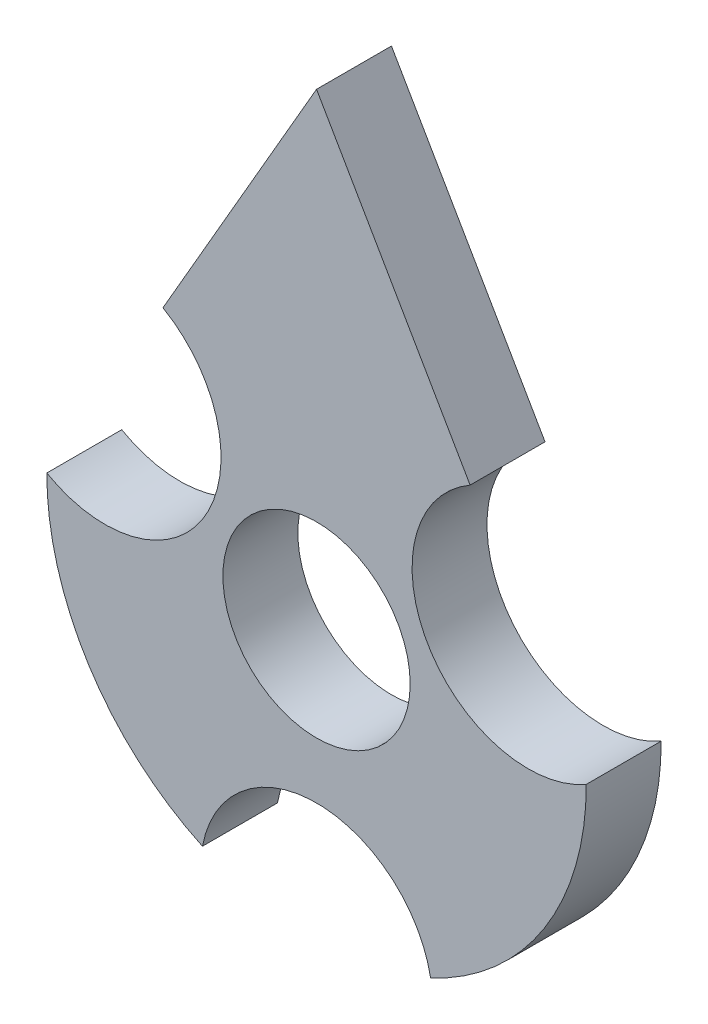
ISO-10303-21;
HEADER;
FILE_DESCRIPTION(('STEP AP214'),'2;1');
FILE_NAME('part.step','',(''),(''),'','','');
FILE_SCHEMA(('AUTOMOTIVE_DESIGN { 1 0 10303 214 1 1 1 1 }'));
ENDSEC;
DATA;
#1=APPLICATION_CONTEXT('core data for automotive mechanical design processes');
#2=APPLICATION_PROTOCOL_DEFINITION('international standard','automotive_design',2000,#1);
#3=PRODUCT_CONTEXT('',#1,'mechanical');
#4=PRODUCT('Part','Part','',(#3));
#5=PRODUCT_RELATED_PRODUCT_CATEGORY('part','',(#4));
#6=PRODUCT_DEFINITION_FORMATION('','',#4);
#7=PRODUCT_DEFINITION_CONTEXT('part definition',#1,'design');
#8=PRODUCT_DEFINITION('design','',#6,#7);
#9=PRODUCT_DEFINITION_SHAPE('','',#8);
#10=(LENGTH_UNIT() NAMED_UNIT(*) SI_UNIT(.MILLI.,.METRE.));
#11=(NAMED_UNIT(*) PLANE_ANGLE_UNIT() SI_UNIT($,.RADIAN.));
#12=(NAMED_UNIT(*) SI_UNIT($,.STERADIAN.) SOLID_ANGLE_UNIT());
#13=UNCERTAINTY_MEASURE_WITH_UNIT(LENGTH_MEASURE(1.E-05),#10,'distance_accuracy_value','');
#14=(GEOMETRIC_REPRESENTATION_CONTEXT(3) GLOBAL_UNCERTAINTY_ASSIGNED_CONTEXT((#13)) GLOBAL_UNIT_ASSIGNED_CONTEXT((#10,
#11,#12)) REPRESENTATION_CONTEXT('',''));
#15=CARTESIAN_POINT('',(0.,0.,0.));
#16=DIRECTION('',(0.,0.,1.));
#17=DIRECTION('',(1.,0.,0.));
#18=AXIS2_PLACEMENT_3D('',#15,#16,#17);
#19=CARTESIAN_POINT('',(0.,0.,10.));
#20=DIRECTION('',(0.,0.,1.));
#21=DIRECTION('',(1.,0.,0.));
#22=AXIS2_PLACEMENT_3D('',#19,#20,#21);
#23=PLANE('',#22);
#24=CARTESIAN_POINT('',(0.,0.,10.));
#25=DIRECTION('',(0.,0.,1.));
#26=DIRECTION('',(1.,0.,0.));
#27=AXIS2_PLACEMENT_3D('',#24,#25,#26);
#28=CIRCLE('',#27,72.);
#29=CARTESIAN_POINT('',(-71.9994078864265,0.292000006815868,10.));
#30=VERTEX_POINT('',#29);
#31=CARTESIAN_POINT('',(-30.4600707409185,-65.2394366197183,10.));
#32=VERTEX_POINT('',#31);
#33=EDGE_CURVE('E141',#30,#32,#28,.T.);
#34=ORIENTED_EDGE('',*,*,#33,.T.);
#35=CARTESIAN_POINT('',(0.,-71.,10.));
#36=DIRECTION('',(0.,0.,-1.));
#37=DIRECTION('',(1.,0.,0.));
#38=AXIS2_PLACEMENT_3D('',#35,#36,#37);
#39=CIRCLE('',#38,31.);
#40=CARTESIAN_POINT('',(30.4600707409185,-65.2394366197183,10.));
#41=VERTEX_POINT('',#40);
#42=EDGE_CURVE('E94',#32,#41,#39,.T.);
#43=ORIENTED_EDGE('',*,*,#42,.T.);
#44=CARTESIAN_POINT('',(0.,0.,10.));
#45=DIRECTION('',(0.,0.,1.));
#46=DIRECTION('',(1.,0.,0.));
#47=AXIS2_PLACEMENT_3D('',#44,#45,#46);
#48=CIRCLE('',#47,72.);
#49=CARTESIAN_POINT('',(71.9994078864265,0.292000006815876,10.));
#50=VERTEX_POINT('',#49);
#51=EDGE_CURVE('E153',#41,#50,#48,.T.);
#52=ORIENTED_EDGE('',*,*,#51,.T.);
#53=CARTESIAN_POINT('',(56.5000000000001,27.1391293723585,10.));
#54=DIRECTION('',(0.,0.,-1.));
#55=DIRECTION('',(-1.,0.,0.));
#56=AXIS2_PLACEMENT_3D('',#53,#54,#55);
#57=CIRCLE('',#56,31.);
#58=CARTESIAN_POINT('',(41.0000000000001,53.9859168896761,10.));
#59=VERTEX_POINT('',#58);
#60=EDGE_CURVE('E110',#50,#59,#57,.T.);
#61=ORIENTED_EDGE('',*,*,#60,.T.);
#62=DIRECTION('',(-0.500000000000001,0.866025403784438,0.));
#63=VECTOR('',#62,1.);
#64=CARTESIAN_POINT('',(0.,125.,10.));
#65=LINE('',#64,#63);
#66=CARTESIAN_POINT('',(0.,125.,10.));
#67=VERTEX_POINT('',#66);
#68=EDGE_CURVE('E104',#59,#67,#65,.T.);
#69=ORIENTED_EDGE('',*,*,#68,.T.);
#70=DIRECTION('',(-0.500000000000001,-0.866025403784438,0.));
#71=VECTOR('',#70,1.);
#72=CARTESIAN_POINT('',(0.,125.,10.));
#73=LINE('',#72,#71);
#74=CARTESIAN_POINT('',(-41.0000000000001,53.9859168896761,10.));
#75=VERTEX_POINT('',#74);
#76=EDGE_CURVE('E108',#67,#75,#73,.T.);
#77=ORIENTED_EDGE('',*,*,#76,.T.);
#78=CARTESIAN_POINT('',(-56.5000000000001,27.1391293723585,10.));
#79=DIRECTION('',(0.,0.,-1.));
#80=DIRECTION('',(1.,0.,0.));
#81=AXIS2_PLACEMENT_3D('',#78,#79,#80);
#82=CIRCLE('',#81,31.);
#83=EDGE_CURVE('E54',#75,#30,#82,.T.);
#84=ORIENTED_EDGE('',*,*,#83,.T.);
#85=EDGE_LOOP('',(#34,#43,#52,#61,#69,#77,#84));
#86=FACE_BOUND('',#85,.T.);
#87=CARTESIAN_POINT('',(0.,0.,10.));
#88=DIRECTION('',(0.,0.,1.));
#89=DIRECTION('',(1.,0.,0.));
#90=AXIS2_PLACEMENT_3D('',#87,#88,#89);
#91=CIRCLE('',#90,25.);
#92=CARTESIAN_POINT('',(25.,0.,10.));
#93=VERTEX_POINT('',#92);
#94=EDGE_CURVE('E132',#93,#93,#91,.T.);
#95=ORIENTED_EDGE('',*,*,#94,.F.);
#96=EDGE_LOOP('',(#95));
#97=FACE_BOUND('',#96,.T.);
#98=ADVANCED_FACE('F37',(#86,#97),#23,.T.);
#99=CARTESIAN_POINT('',(0.,0.,-10.));
#100=DIRECTION('',(0.,0.,1.));
#101=DIRECTION('',(1.,0.,0.));
#102=AXIS2_PLACEMENT_3D('',#99,#100,#101);
#103=PLANE('',#102);
#104=CARTESIAN_POINT('',(0.,0.,-10.));
#105=DIRECTION('',(0.,0.,1.));
#106=DIRECTION('',(1.,0.,0.));
#107=AXIS2_PLACEMENT_3D('',#104,#105,#106);
#108=CIRCLE('',#107,72.);
#109=CARTESIAN_POINT('',(-71.9994078864265,0.292000006815868,-10.));
#110=VERTEX_POINT('',#109);
#111=CARTESIAN_POINT('',(-30.4600707409185,-65.2394366197183,-10.));
#112=VERTEX_POINT('',#111);
#113=EDGE_CURVE('E128',#110,#112,#108,.T.);
#114=ORIENTED_EDGE('',*,*,#113,.F.);
#115=CARTESIAN_POINT('',(-56.5000000000001,27.1391293723585,-10.));
#116=DIRECTION('',(0.,0.,-1.));
#117=DIRECTION('',(1.,0.,0.));
#118=AXIS2_PLACEMENT_3D('',#115,#116,#117);
#119=CIRCLE('',#118,31.);
#120=CARTESIAN_POINT('',(-41.0000000000001,53.9859168896761,-10.));
#121=VERTEX_POINT('',#120);
#122=EDGE_CURVE('E86',#121,#110,#119,.T.);
#123=ORIENTED_EDGE('',*,*,#122,.F.);
#124=DIRECTION('',(-0.500000000000001,-0.866025403784438,0.));
#125=VECTOR('',#124,1.);
#126=CARTESIAN_POINT('',(0.,125.,-10.));
#127=LINE('',#126,#125);
#128=CARTESIAN_POINT('',(0.,125.,-10.));
#129=VERTEX_POINT('',#128);
#130=EDGE_CURVE('E80',#129,#121,#127,.T.);
#131=ORIENTED_EDGE('',*,*,#130,.F.);
#132=DIRECTION('',(-0.500000000000001,0.866025403784438,0.));
#133=VECTOR('',#132,1.);
#134=CARTESIAN_POINT('',(0.,125.,-10.));
#135=LINE('',#134,#133);
#136=CARTESIAN_POINT('',(41.0000000000001,53.9859168896761,-10.));
#137=VERTEX_POINT('',#136);
#138=EDGE_CURVE('E118',#137,#129,#135,.T.);
#139=ORIENTED_EDGE('',*,*,#138,.F.);
#140=CARTESIAN_POINT('',(56.5000000000001,27.1391293723585,-10.));
#141=DIRECTION('',(0.,0.,-1.));
#142=DIRECTION('',(-1.,0.,0.));
#143=AXIS2_PLACEMENT_3D('',#140,#141,#142);
#144=CIRCLE('',#143,31.);
#145=CARTESIAN_POINT('',(71.9994078864265,0.292000006815876,-10.));
#146=VERTEX_POINT('',#145);
#147=EDGE_CURVE('E136',#146,#137,#144,.T.);
#148=ORIENTED_EDGE('',*,*,#147,.F.);
#149=CARTESIAN_POINT('',(0.,0.,-10.));
#150=DIRECTION('',(0.,0.,1.));
#151=DIRECTION('',(1.,0.,0.));
#152=AXIS2_PLACEMENT_3D('',#149,#150,#151);
#153=CIRCLE('',#152,72.);
#154=CARTESIAN_POINT('',(30.4600707409185,-65.2394366197183,-10.));
#155=VERTEX_POINT('',#154);
#156=EDGE_CURVE('E134',#155,#146,#153,.T.);
#157=ORIENTED_EDGE('',*,*,#156,.F.);
#158=CARTESIAN_POINT('',(0.,-71.,-10.));
#159=DIRECTION('',(0.,0.,-1.));
#160=DIRECTION('',(1.,0.,0.));
#161=AXIS2_PLACEMENT_3D('',#158,#159,#160);
#162=CIRCLE('',#161,31.);
#163=EDGE_CURVE('E131',#112,#155,#162,.T.);
#164=ORIENTED_EDGE('',*,*,#163,.F.);
#165=EDGE_LOOP('',(#114,#123,#131,#139,#148,#157,#164));
#166=FACE_BOUND('',#165,.T.);
#167=CARTESIAN_POINT('',(0.,0.,-10.));
#168=DIRECTION('',(0.,0.,1.));
#169=DIRECTION('',(1.,0.,0.));
#170=AXIS2_PLACEMENT_3D('',#167,#168,#169);
#171=CIRCLE('',#170,25.);
#172=CARTESIAN_POINT('',(25.,0.,-10.));
#173=VERTEX_POINT('',#172);
#174=EDGE_CURVE('E165',#173,#173,#171,.T.);
#175=ORIENTED_EDGE('',*,*,#174,.T.);
#176=EDGE_LOOP('',(#175));
#177=FACE_BOUND('',#176,.T.);
#178=ADVANCED_FACE('F157',(#166,#177),#103,.F.);
#179=CARTESIAN_POINT('',(0.,0.,10.));
#180=DIRECTION('',(0.,0.,-1.));
#181=DIRECTION('',(-1.,0.,0.));
#182=AXIS2_PLACEMENT_3D('',#179,#180,#181);
#183=CYLINDRICAL_SURFACE('',#182,72.);
#184=ORIENTED_EDGE('',*,*,#113,.T.);
#185=DIRECTION('',(0.,0.,-1.));
#186=VECTOR('',#185,1.);
#187=CARTESIAN_POINT('',(-30.4600707409185,-65.2394366197183,10.));
#188=LINE('',#187,#186);
#189=EDGE_CURVE('E11',#32,#112,#188,.T.);
#190=ORIENTED_EDGE('',*,*,#189,.F.);
#191=ORIENTED_EDGE('',*,*,#33,.F.);
#192=DIRECTION('',(0.,0.,-1.));
#193=VECTOR('',#192,1.);
#194=CARTESIAN_POINT('',(-71.9994078864265,0.292000006815868,10.));
#195=LINE('',#194,#193);
#196=EDGE_CURVE('E124',#30,#110,#195,.T.);
#197=ORIENTED_EDGE('',*,*,#196,.T.);
#198=EDGE_LOOP('',(#184,#190,#191,#197));
#199=FACE_BOUND('',#198,.T.);
#200=ADVANCED_FACE('F39',(#199),#183,.T.);
#201=CARTESIAN_POINT('',(0.,-71.,10.));
#202=DIRECTION('',(0.,0.,-1.));
#203=DIRECTION('',(-1.,0.,0.));
#204=AXIS2_PLACEMENT_3D('',#201,#202,#203);
#205=CYLINDRICAL_SURFACE('',#204,31.);
#206=ORIENTED_EDGE('',*,*,#163,.T.);
#207=DIRECTION('',(0.,0.,-1.));
#208=VECTOR('',#207,1.);
#209=CARTESIAN_POINT('',(30.4600707409185,-65.2394366197183,10.));
#210=LINE('',#209,#208);
#211=EDGE_CURVE('E46',#41,#155,#210,.T.);
#212=ORIENTED_EDGE('',*,*,#211,.F.);
#213=ORIENTED_EDGE('',*,*,#42,.F.);
#214=ORIENTED_EDGE('',*,*,#189,.T.);
#215=EDGE_LOOP('',(#206,#212,#213,#214));
#216=FACE_BOUND('',#215,.T.);
#217=ADVANCED_FACE('F191',(#216),#205,.F.);
#218=CARTESIAN_POINT('',(0.,0.,10.));
#219=DIRECTION('',(0.,0.,-1.));
#220=DIRECTION('',(-1.,0.,0.));
#221=AXIS2_PLACEMENT_3D('',#218,#219,#220);
#222=CYLINDRICAL_SURFACE('',#221,72.);
#223=ORIENTED_EDGE('',*,*,#156,.T.);
#224=DIRECTION('',(0.,0.,-1.));
#225=VECTOR('',#224,1.);
#226=CARTESIAN_POINT('',(71.9994078864265,0.292000006815876,10.));
#227=LINE('',#226,#225);
#228=EDGE_CURVE('E145',#50,#146,#227,.T.);
#229=ORIENTED_EDGE('',*,*,#228,.F.);
#230=ORIENTED_EDGE('',*,*,#51,.F.);
#231=ORIENTED_EDGE('',*,*,#211,.T.);
#232=EDGE_LOOP('',(#223,#229,#230,#231));
#233=FACE_BOUND('',#232,.T.);
#234=ADVANCED_FACE('F151',(#233),#222,.T.);
#235=CARTESIAN_POINT('',(56.5000000000001,27.1391293723585,10.));
#236=DIRECTION('',(0.,0.,-1.));
#237=DIRECTION('',(-1.,0.,0.));
#238=AXIS2_PLACEMENT_3D('',#235,#236,#237);
#239=CYLINDRICAL_SURFACE('',#238,31.);
#240=ORIENTED_EDGE('',*,*,#147,.T.);
#241=DIRECTION('',(0.,0.,-1.));
#242=VECTOR('',#241,1.);
#243=CARTESIAN_POINT('',(41.0000000000001,53.9859168896761,10.));
#244=LINE('',#243,#242);
#245=EDGE_CURVE('E119',#59,#137,#244,.T.);
#246=ORIENTED_EDGE('',*,*,#245,.F.);
#247=ORIENTED_EDGE('',*,*,#60,.F.);
#248=ORIENTED_EDGE('',*,*,#228,.T.);
#249=EDGE_LOOP('',(#240,#246,#247,#248));
#250=FACE_BOUND('',#249,.T.);
#251=ADVANCED_FACE('F160',(#250),#239,.F.);
#252=CARTESIAN_POINT('',(0.,125.,10.));
#253=DIRECTION('',(-0.866025403784438,-0.500000000000001,0.));
#254=DIRECTION('',(0.500000000000001,-0.866025403784438,0.));
#255=AXIS2_PLACEMENT_3D('',#252,#253,#254);
#256=PLANE('',#255);
#257=ORIENTED_EDGE('',*,*,#138,.T.);
#258=DIRECTION('',(0.,0.,-1.));
#259=VECTOR('',#258,1.);
#260=CARTESIAN_POINT('',(0.,125.,10.));
#261=LINE('',#260,#259);
#262=EDGE_CURVE('E115',#67,#129,#261,.T.);
#263=ORIENTED_EDGE('',*,*,#262,.F.);
#264=ORIENTED_EDGE('',*,*,#68,.F.);
#265=ORIENTED_EDGE('',*,*,#245,.T.);
#266=EDGE_LOOP('',(#257,#263,#264,#265));
#267=FACE_BOUND('',#266,.T.);
#268=ADVANCED_FACE('F116',(#267),#256,.F.);
#269=CARTESIAN_POINT('',(0.,125.,10.));
#270=DIRECTION('',(0.866025403784438,-0.500000000000001,0.));
#271=DIRECTION('',(0.500000000000001,0.866025403784438,0.));
#272=AXIS2_PLACEMENT_3D('',#269,#270,#271);
#273=PLANE('',#272);
#274=ORIENTED_EDGE('',*,*,#130,.T.);
#275=DIRECTION('',(0.,0.,-1.));
#276=VECTOR('',#275,1.);
#277=CARTESIAN_POINT('',(-41.0000000000001,53.9859168896761,10.));
#278=LINE('',#277,#276);
#279=EDGE_CURVE('E120',#75,#121,#278,.T.);
#280=ORIENTED_EDGE('',*,*,#279,.F.);
#281=ORIENTED_EDGE('',*,*,#76,.F.);
#282=ORIENTED_EDGE('',*,*,#262,.T.);
#283=EDGE_LOOP('',(#274,#280,#281,#282));
#284=FACE_BOUND('',#283,.T.);
#285=ADVANCED_FACE('F122',(#284),#273,.F.);
#286=CARTESIAN_POINT('',(-56.5000000000001,27.1391293723585,10.));
#287=DIRECTION('',(0.,0.,-1.));
#288=DIRECTION('',(-1.,0.,0.));
#289=AXIS2_PLACEMENT_3D('',#286,#287,#288);
#290=CYLINDRICAL_SURFACE('',#289,31.);
#291=ORIENTED_EDGE('',*,*,#122,.T.);
#292=ORIENTED_EDGE('',*,*,#196,.F.);
#293=ORIENTED_EDGE('',*,*,#83,.F.);
#294=ORIENTED_EDGE('',*,*,#279,.T.);
#295=EDGE_LOOP('',(#291,#292,#293,#294));
#296=FACE_BOUND('',#295,.T.);
#297=ADVANCED_FACE('F181',(#296),#290,.F.);
#298=CARTESIAN_POINT('',(0.,0.,10.));
#299=DIRECTION('',(0.,0.,-1.));
#300=DIRECTION('',(-1.,0.,0.));
#301=AXIS2_PLACEMENT_3D('',#298,#299,#300);
#302=CYLINDRICAL_SURFACE('',#301,25.);
#303=ORIENTED_EDGE('',*,*,#94,.T.);
#304=EDGE_LOOP('',(#303));
#305=FACE_BOUND('',#304,.T.);
#306=ORIENTED_EDGE('',*,*,#174,.F.);
#307=EDGE_LOOP('',(#306));
#308=FACE_BOUND('',#307,.T.);
#309=ADVANCED_FACE('F171',(#305,#308),#302,.F.);
#310=CLOSED_SHELL('',(#98,#178,#200,#217,#234,#251,#268,#285,#297,#309));
#311=MANIFOLD_SOLID_BREP('B2',#310);
#312=ADVANCED_BREP_SHAPE_REPRESENTATION('',(#18,#311),#14);
#313=SHAPE_DEFINITION_REPRESENTATION(#9,#312);
ENDSEC;
END-ISO-10303-21;
